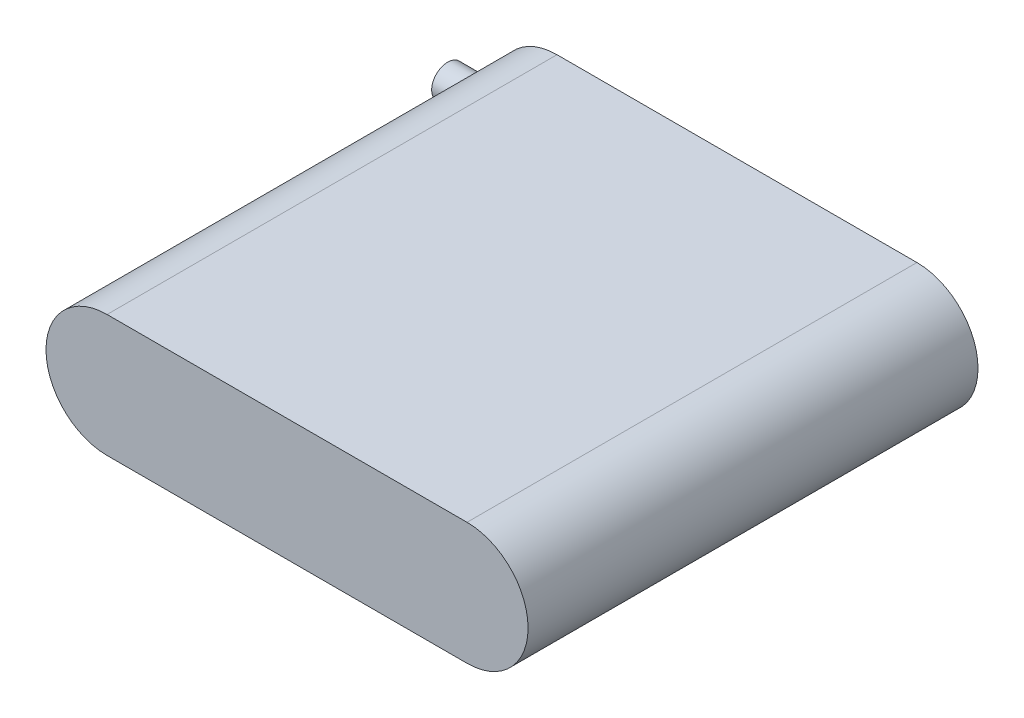
ISO-10303-21;
HEADER;
FILE_DESCRIPTION(('STEP AP214'),'2;1');
FILE_NAME('part.step','',(''),(''),'','','');
FILE_SCHEMA(('AUTOMOTIVE_DESIGN { 1 0 10303 214 1 1 1 1 }'));
ENDSEC;
DATA;
#1=APPLICATION_CONTEXT('core data for automotive mechanical design processes');
#2=APPLICATION_PROTOCOL_DEFINITION('international standard','automotive_design',2000,#1);
#3=PRODUCT_CONTEXT('',#1,'mechanical');
#4=PRODUCT('Part','Part','',(#3));
#5=PRODUCT_RELATED_PRODUCT_CATEGORY('part','',(#4));
#6=PRODUCT_DEFINITION_FORMATION('','',#4);
#7=PRODUCT_DEFINITION_CONTEXT('part definition',#1,'design');
#8=PRODUCT_DEFINITION('design','',#6,#7);
#9=PRODUCT_DEFINITION_SHAPE('','',#8);
#10=(LENGTH_UNIT() NAMED_UNIT(*) SI_UNIT(.MILLI.,.METRE.));
#11=(NAMED_UNIT(*) PLANE_ANGLE_UNIT() SI_UNIT($,.RADIAN.));
#12=(NAMED_UNIT(*) SI_UNIT($,.STERADIAN.) SOLID_ANGLE_UNIT());
#13=UNCERTAINTY_MEASURE_WITH_UNIT(LENGTH_MEASURE(1.E-05),#10,'distance_accuracy_value','');
#14=(GEOMETRIC_REPRESENTATION_CONTEXT(3) GLOBAL_UNCERTAINTY_ASSIGNED_CONTEXT((#13)) GLOBAL_UNIT_ASSIGNED_CONTEXT((#10,
#11,#12)) REPRESENTATION_CONTEXT('',''));
#15=CARTESIAN_POINT('',(0.,0.,0.));
#16=DIRECTION('',(0.,0.,1.));
#17=DIRECTION('',(1.,0.,0.));
#18=AXIS2_PLACEMENT_3D('',#15,#16,#17);
#19=CARTESIAN_POINT('',(-28.,0.,70.));
#20=DIRECTION('',(0.,0.,-1.));
#21=DIRECTION('',(-1.,0.,0.));
#22=AXIS2_PLACEMENT_3D('',#19,#20,#21);
#23=CYLINDRICAL_SURFACE('',#22,9.50000000000001);
#24=CARTESIAN_POINT('',(-28.,0.,0.));
#25=DIRECTION('',(0.,0.,1.));
#26=DIRECTION('',(1.,0.,0.));
#27=AXIS2_PLACEMENT_3D('',#24,#25,#26);
#28=CIRCLE('',#27,9.50000000000001);
#29=CARTESIAN_POINT('',(-28.,9.50000000000001,0.));
#30=VERTEX_POINT('',#29);
#31=CARTESIAN_POINT('',(-37.5,0.,0.));
#32=VERTEX_POINT('',#31);
#33=EDGE_CURVE('E108',#30,#32,#28,.T.);
#34=ORIENTED_EDGE('',*,*,#33,.T.);
#35=CARTESIAN_POINT('',(-37.5,0.,5.));
#36=CARTESIAN_POINT('',(-37.4999978589319,-0.137884663200172,4.99999659165872));
#37=CARTESIAN_POINT('',(-37.4969684555372,-0.275806169982059,4.98855441851344));
#38=CARTESIAN_POINT('',(-37.4851776261452,-0.547680422104076,4.94316636127436));
#39=CARTESIAN_POINT('',(-37.4764133364158,-0.68163114967387,4.90920923415978));
#40=CARTESIAN_POINT('',(-37.4541207632604,-0.94159979521833,4.81996842460177));
#41=CARTESIAN_POINT('',(-37.4405985339507,-1.06762755548515,4.76471183560934));
#42=CARTESIAN_POINT('',(-37.4102215153283,-1.30862652881559,4.63453997893622));
#43=CARTESIAN_POINT('',(-37.3933665271721,-1.4235970815608,4.55962353819611));
#44=CARTESIAN_POINT('',(-37.3577194163659,-1.64181993629425,4.39046838430234));
#45=CARTESIAN_POINT('',(-37.3388948672796,-1.74478634632154,4.29586767243448));
#46=CARTESIAN_POINT('',(-37.3016400295756,-1.93359084586557,4.09080344133392));
#47=CARTESIAN_POINT('',(-37.2832097905785,-2.01942679084604,3.98033793898573));
#48=CARTESIAN_POINT('',(-37.2484996611009,-2.17291708512181,3.74441123162361));
#49=CARTESIAN_POINT('',(-37.2322607379211,-2.24024449868174,3.61873074770613));
#50=CARTESIAN_POINT('',(-37.2042478064017,-2.35270147526438,3.3573378957766));
#51=CARTESIAN_POINT('',(-37.192472998716,-2.39783501276008,3.22162732895978));
#52=CARTESIAN_POINT('',(-37.1750559470992,-2.46363395134783,2.94718807189353));
#53=CARTESIAN_POINT('',(-37.1692842436948,-2.48481677617339,2.80859185215417));
#54=CARTESIAN_POINT('',(-37.164139951501,-2.50372582423423,2.52970199432701));
#55=CARTESIAN_POINT('',(-37.1647662007587,-2.50145630672462,2.38940866907858));
#56=CARTESIAN_POINT('',(-37.1722310773399,-2.47393631594875,2.11512977055271));
#57=CARTESIAN_POINT('',(-37.1789010040012,-2.44930986906015,1.98107626626276));
#58=CARTESIAN_POINT('',(-37.197431855868,-2.37877367007175,1.71907399632413));
#59=CARTESIAN_POINT('',(-37.2092931862694,-2.33286225663581,1.59112570806025));
#60=CARTESIAN_POINT('',(-37.2370201088148,-2.22054589835919,1.34332921291467));
#61=CARTESIAN_POINT('',(-37.2529284179497,-2.15392053169779,1.22358589593431));
#62=CARTESIAN_POINT('',(-37.2869336228155,-2.0022213702002,0.996758640855073));
#63=CARTESIAN_POINT('',(-37.305030938861,-1.91714402987704,0.889677141802086));
#64=CARTESIAN_POINT('',(-37.3420790135668,-1.72775627146102,0.687645507544652));
#65=CARTESIAN_POINT('',(-37.3610386322012,-1.62292126601543,0.593188078020189));
#66=CARTESIAN_POINT('',(-37.3971595158715,-1.39866809045069,0.423095345602232));
#67=CARTESIAN_POINT('',(-37.4143207136378,-1.27924937519245,0.347460746627419));
#68=CARTESIAN_POINT('',(-37.4450121987702,-1.02846858783735,0.216951570038363));
#69=CARTESIAN_POINT('',(-37.458527169222,-0.897059143717845,0.162164183163548));
#70=CARTESIAN_POINT('',(-37.4802925914504,-0.626458525351708,0.0755995862040235));
#71=CARTESIAN_POINT('',(-37.4885441625268,-0.487269012444901,0.0438174836860816));
#72=CARTESIAN_POINT('',(-37.4986845679861,-0.209265832527541,0.00493467936550412));
#73=CARTESIAN_POINT('',(-37.5007461055602,-0.0705520479839257,-0.00283612700281629));
#74=CARTESIAN_POINT('',(-37.4987696960493,0.206196087317417,0.00467639612566586));
#75=CARTESIAN_POINT('',(-37.4947323617119,0.344230504932657,0.0199574096285375));
#76=CARTESIAN_POINT('',(-37.4811232137566,0.613323515414336,0.0725895456161335));
#77=CARTESIAN_POINT('',(-37.4716447424017,0.74446002052707,0.109568670034884));
#78=CARTESIAN_POINT('',(-37.4482269066691,0.998656954500428,0.204116870543619));
#79=CARTESIAN_POINT('',(-37.434287065508,1.12171651848975,0.261688147378892));
#80=CARTESIAN_POINT('',(-37.4030861256774,1.35888360619122,0.397041322133153));
#81=CARTESIAN_POINT('',(-37.3857663901138,1.47277384906795,0.475190089572068));
#82=CARTESIAN_POINT('',(-37.3498086065798,1.68605972580165,0.649017030390486));
#83=CARTESIAN_POINT('',(-37.3311703057013,1.78545256772039,0.744698572282375));
#84=CARTESIAN_POINT('',(-37.2940435475429,1.96973268881778,0.953999010701906));
#85=CARTESIAN_POINT('',(-37.2755731986939,2.05414772804202,1.06803766334183));
#86=CARTESIAN_POINT('',(-37.241436995468,2.20265077284399,1.30905049612895));
#87=CARTESIAN_POINT('',(-37.2257710218657,2.26673964265903,1.43602412599754));
#88=CARTESIAN_POINT('',(-37.1991961819113,2.37228864024204,1.69865623456444));
#89=CARTESIAN_POINT('',(-37.1882596272304,2.41388084425638,1.83425868115596));
#90=CARTESIAN_POINT('',(-37.172371005321,2.47357685539613,2.11086822724662));
#91=CARTESIAN_POINT('',(-37.1674174572766,2.49168647462763,2.25187398049023));
#92=CARTESIAN_POINT('',(-37.1641771027186,2.5035754058712,2.5304591777129));
#93=CARTESIAN_POINT('',(-37.165682569037,2.49811278703346,2.66800434532392));
#94=CARTESIAN_POINT('',(-37.1747055727312,2.46476570057896,2.9401380041869));
#95=CARTESIAN_POINT('',(-37.182222962993,2.43688178162009,3.07472656770532));
#96=CARTESIAN_POINT('',(-37.2023008136189,2.35991776153104,3.33620045149248));
#97=CARTESIAN_POINT('',(-37.214823953068,2.31099432245761,3.46313495108551));
#98=CARTESIAN_POINT('',(-37.2435040513402,2.19346205912632,3.70708916373462));
#99=CARTESIAN_POINT('',(-37.2596615663135,2.12485022160876,3.82410735557115));
#100=CARTESIAN_POINT('',(-37.2943694141833,1.96757430903026,4.04853541258251));
#101=CARTESIAN_POINT('',(-37.3129751314196,1.87839103794925,4.1555729175733));
#102=CARTESIAN_POINT('',(-37.3501692174917,1.68349652387403,4.35340941336072));
#103=CARTESIAN_POINT('',(-37.3687575810452,1.57778128982408,4.44420447161773));
#104=CARTESIAN_POINT('',(-37.4042817581821,1.35018708630133,4.60882024635572));
#105=CARTESIAN_POINT('',(-37.4211754773805,1.22801920680847,4.68225135974023));
#106=CARTESIAN_POINT('',(-37.4509501600656,0.972633879166112,4.80741745059363));
#107=CARTESIAN_POINT('',(-37.4638337625023,0.839423771021183,4.85916670410621));
#108=CARTESIAN_POINT('',(-37.482418709181,0.588875796526842,4.93254809015213));
#109=CARTESIAN_POINT('',(-37.4889642500444,0.472643351989963,4.95778470053471));
#110=CARTESIAN_POINT('',(-37.4977556173977,0.237616231690471,4.99151134277624));
#111=CARTESIAN_POINT('',(-37.5000018450606,0.118821796035808,5.00000293713038));
#112=CARTESIAN_POINT('',(-37.5,0.,5.));
#113=B_SPLINE_CURVE_WITH_KNOTS('',3,(#35,#36,#37,#38,#39,#40,#41,#42,#43,#44,#45,#46,#47,#48,
#49,#50,#51,#52,#53,#54,#55,#56,#57,#58,#59,#60,#61,#62,#63,#64,#65,#66,#67,#68,#69,#70,#71,#72,
#73,#74,#75,#76,#77,#78,#79,#80,#81,#82,#83,#84,#85,#86,#87,#88,#89,#90,#91,#92,#93,#94,#95,#96,
#97,#98,#99,#100,#101,#102,#103,#104,#105,#106,#107,#108,#109,#110,#111,#112),.UNSPECIFIED.,.T.,
.F.,(4,2,2,2,2,2,2,2,2,2,2,2,2,2,2,2,2,2,2,2,2,2,2,2,2,2,2,2,2,2,2,2,2,2,2,2,2,2,4),(0.,
0.413218307292529,0.82664311398427,1.23954376015726,1.65246904879306,2.07379267437497,
2.49516901176602,2.92356960617624,3.35189345476612,3.77077570910304,4.18958189022737,
4.59704611478664,5.00454214813609,5.41653210536598,5.82860129537587,6.2537447574079,
6.67890411617069,7.10582259900532,7.53265026425716,7.9474532588793,8.36221458142333,
8.7700647180204,9.17795845581901,9.59368485631319,10.0094912128133,10.4366941512347,
10.8638789232118,11.2885277256592,11.7130714044454,12.1240655288083,12.5350495962919,
12.9430250337226,13.3510629440972,13.7708169031548,14.1906723537905,14.6192052314105,
15.0474555038948,15.4035786755636,15.7596686154295),.UNSPECIFIED.);
#114=EDGE_CURVE('E51',#32,#32,#113,.T.);
#115=ORIENTED_EDGE('',*,*,#114,.T.);
#116=CARTESIAN_POINT('',(-28.,-9.50000000000001,0.));
#117=VERTEX_POINT('',#116);
#118=EDGE_CURVE('E111',#32,#117,#28,.T.);
#119=ORIENTED_EDGE('',*,*,#118,.T.);
#120=DIRECTION('',(0.,0.,-1.));
#121=VECTOR('',#120,1.);
#122=CARTESIAN_POINT('',(-28.,-9.50000000000001,70.));
#123=LINE('',#122,#121);
#124=CARTESIAN_POINT('',(-28.,-9.50000000000001,70.));
#125=VERTEX_POINT('',#124);
#126=EDGE_CURVE('E11',#125,#117,#123,.T.);
#127=ORIENTED_EDGE('',*,*,#126,.F.);
#128=CARTESIAN_POINT('',(-28.,0.,70.));
#129=DIRECTION('',(0.,0.,1.));
#130=DIRECTION('',(1.,0.,0.));
#131=AXIS2_PLACEMENT_3D('',#128,#129,#130);
#132=CIRCLE('',#131,9.50000000000001);
#133=CARTESIAN_POINT('',(-28.,9.50000000000001,70.));
#134=VERTEX_POINT('',#133);
#135=EDGE_CURVE('E92',#134,#125,#132,.T.);
#136=ORIENTED_EDGE('',*,*,#135,.F.);
#137=DIRECTION('',(0.,0.,-1.));
#138=VECTOR('',#137,1.);
#139=CARTESIAN_POINT('',(-28.,9.50000000000001,70.));
#140=LINE('',#139,#138);
#141=EDGE_CURVE('E104',#134,#30,#140,.T.);
#142=ORIENTED_EDGE('',*,*,#141,.T.);
#143=EDGE_LOOP('',(#34,#115,#119,#127,#136,#142));
#144=FACE_BOUND('',#143,.T.);
#145=ADVANCED_FACE('F38',(#144),#23,.T.);
#146=CARTESIAN_POINT('',(-28.,-9.50000000000001,70.));
#147=DIRECTION('',(0.,1.,0.));
#148=DIRECTION('',(0.,0.,1.));
#149=AXIS2_PLACEMENT_3D('',#146,#147,#148);
#150=PLANE('',#149);
#151=DIRECTION('',(1.,0.,0.));
#152=VECTOR('',#151,1.);
#153=CARTESIAN_POINT('',(-28.,-9.50000000000001,0.));
#154=LINE('',#153,#152);
#155=CARTESIAN_POINT('',(28.,-9.5,0.));
#156=VERTEX_POINT('',#155);
#157=EDGE_CURVE('E98',#117,#156,#154,.T.);
#158=ORIENTED_EDGE('',*,*,#157,.T.);
#159=DIRECTION('',(0.,0.,-1.));
#160=VECTOR('',#159,1.);
#161=CARTESIAN_POINT('',(28.,-9.5,70.));
#162=LINE('',#161,#160);
#163=CARTESIAN_POINT('',(28.,-9.5,70.));
#164=VERTEX_POINT('',#163);
#165=EDGE_CURVE('E46',#164,#156,#162,.T.);
#166=ORIENTED_EDGE('',*,*,#165,.F.);
#167=DIRECTION('',(1.,0.,0.));
#168=VECTOR('',#167,1.);
#169=CARTESIAN_POINT('',(-28.,-9.50000000000001,70.));
#170=LINE('',#169,#168);
#171=EDGE_CURVE('E86',#125,#164,#170,.T.);
#172=ORIENTED_EDGE('',*,*,#171,.F.);
#173=ORIENTED_EDGE('',*,*,#126,.T.);
#174=EDGE_LOOP('',(#158,#166,#172,#173));
#175=FACE_BOUND('',#174,.T.);
#176=ADVANCED_FACE('F96',(#175),#150,.F.);
#177=CARTESIAN_POINT('',(28.,0.,70.));
#178=DIRECTION('',(0.,0.,-1.));
#179=DIRECTION('',(-1.,0.,0.));
#180=AXIS2_PLACEMENT_3D('',#177,#178,#179);
#181=CYLINDRICAL_SURFACE('',#180,9.50000000000001);
#182=CARTESIAN_POINT('',(28.,0.,0.));
#183=DIRECTION('',(0.,0.,1.));
#184=DIRECTION('',(1.,0.,0.));
#185=AXIS2_PLACEMENT_3D('',#182,#183,#184);
#186=CIRCLE('',#185,9.50000000000001);
#187=CARTESIAN_POINT('',(28.,9.50000000000001,0.));
#188=VERTEX_POINT('',#187);
#189=EDGE_CURVE('E113',#156,#188,#186,.T.);
#190=ORIENTED_EDGE('',*,*,#189,.T.);
#191=DIRECTION('',(0.,0.,-1.));
#192=VECTOR('',#191,1.);
#193=CARTESIAN_POINT('',(28.,9.50000000000001,70.));
#194=LINE('',#193,#192);
#195=CARTESIAN_POINT('',(28.,9.50000000000001,70.));
#196=VERTEX_POINT('',#195);
#197=EDGE_CURVE('E101',#196,#188,#194,.T.);
#198=ORIENTED_EDGE('',*,*,#197,.F.);
#199=CARTESIAN_POINT('',(28.,0.,70.));
#200=DIRECTION('',(0.,0.,1.));
#201=DIRECTION('',(1.,0.,0.));
#202=AXIS2_PLACEMENT_3D('',#199,#200,#201);
#203=CIRCLE('',#202,9.50000000000001);
#204=EDGE_CURVE('E89',#164,#196,#203,.T.);
#205=ORIENTED_EDGE('',*,*,#204,.F.);
#206=ORIENTED_EDGE('',*,*,#165,.T.);
#207=EDGE_LOOP('',(#190,#198,#205,#206));
#208=FACE_BOUND('',#207,.T.);
#209=ADVANCED_FACE('F102',(#208),#181,.T.);
#210=CARTESIAN_POINT('',(-28.,9.50000000000001,70.));
#211=DIRECTION('',(0.,-1.,0.));
#212=DIRECTION('',(0.,0.,-1.));
#213=AXIS2_PLACEMENT_3D('',#210,#211,#212);
#214=PLANE('',#213);
#215=DIRECTION('',(-1.,0.,0.));
#216=VECTOR('',#215,1.);
#217=CARTESIAN_POINT('',(-28.,9.50000000000001,0.));
#218=LINE('',#217,#216);
#219=EDGE_CURVE('E79',#188,#30,#218,.T.);
#220=ORIENTED_EDGE('',*,*,#219,.T.);
#221=ORIENTED_EDGE('',*,*,#141,.F.);
#222=DIRECTION('',(-1.,0.,0.));
#223=VECTOR('',#222,1.);
#224=CARTESIAN_POINT('',(-28.,9.50000000000001,70.));
#225=LINE('',#224,#223);
#226=EDGE_CURVE('E59',#196,#134,#225,.T.);
#227=ORIENTED_EDGE('',*,*,#226,.F.);
#228=ORIENTED_EDGE('',*,*,#197,.T.);
#229=EDGE_LOOP('',(#220,#221,#227,#228));
#230=FACE_BOUND('',#229,.T.);
#231=ADVANCED_FACE('F117',(#230),#214,.F.);
#232=CARTESIAN_POINT('',(-28.,0.,70.));
#233=DIRECTION('',(0.,0.,1.));
#234=DIRECTION('',(1.,0.,0.));
#235=AXIS2_PLACEMENT_3D('',#232,#233,#234);
#236=PLANE('',#235);
#237=ORIENTED_EDGE('',*,*,#135,.T.);
#238=ORIENTED_EDGE('',*,*,#171,.T.);
#239=ORIENTED_EDGE('',*,*,#204,.T.);
#240=ORIENTED_EDGE('',*,*,#226,.T.);
#241=EDGE_LOOP('',(#237,#238,#239,#240));
#242=FACE_BOUND('',#241,.T.);
#243=ADVANCED_FACE('F87',(#242),#236,.T.);
#244=CARTESIAN_POINT('',(-28.,0.,0.));
#245=DIRECTION('',(0.,0.,1.));
#246=DIRECTION('',(1.,0.,0.));
#247=AXIS2_PLACEMENT_3D('',#244,#245,#246);
#248=PLANE('',#247);
#249=ORIENTED_EDGE('',*,*,#118,.F.);
#250=ORIENTED_EDGE('',*,*,#33,.F.);
#251=ORIENTED_EDGE('',*,*,#219,.F.);
#252=ORIENTED_EDGE('',*,*,#189,.F.);
#253=ORIENTED_EDGE('',*,*,#157,.F.);
#254=EDGE_LOOP('',(#249,#250,#251,#252,#253));
#255=FACE_BOUND('',#254,.T.);
#256=ADVANCED_FACE('F121',(#255),#248,.F.);
#257=CARTESIAN_POINT('',(-27.5,0.,2.5));
#258=DIRECTION('',(-1.,0.,0.));
#259=DIRECTION('',(0.,0.,1.));
#260=AXIS2_PLACEMENT_3D('',#257,#258,#259);
#261=CYLINDRICAL_SURFACE('',#260,2.5);
#262=CARTESIAN_POINT('',(-42.5,0.,2.5));
#263=DIRECTION('',(-1.,0.,0.));
#264=DIRECTION('',(0.,0.,1.));
#265=AXIS2_PLACEMENT_3D('',#262,#263,#264);
#266=CIRCLE('',#265,2.5);
#267=CARTESIAN_POINT('',(-42.5,0.,5.));
#268=VERTEX_POINT('',#267);
#269=EDGE_CURVE('E129',#268,#268,#266,.T.);
#270=ORIENTED_EDGE('',*,*,#269,.F.);
#271=EDGE_LOOP('',(#270));
#272=FACE_BOUND('',#271,.T.);
#273=ORIENTED_EDGE('',*,*,#114,.F.);
#274=EDGE_LOOP('',(#273));
#275=FACE_BOUND('',#274,.T.);
#276=ADVANCED_FACE('F130',(#272,#275),#261,.T.);
#277=CARTESIAN_POINT('',(-42.5,0.,2.5));
#278=DIRECTION('',(-1.,0.,0.));
#279=DIRECTION('',(0.,0.,1.));
#280=AXIS2_PLACEMENT_3D('',#277,#278,#279);
#281=PLANE('',#280);
#282=ORIENTED_EDGE('',*,*,#269,.T.);
#283=EDGE_LOOP('',(#282));
#284=FACE_BOUND('',#283,.T.);
#285=ADVANCED_FACE('F135',(#284),#281,.T.);
#286=CLOSED_SHELL('',(#145,#176,#209,#231,#243,#256,#276,#285));
#287=MANIFOLD_SOLID_BREP('B2',#286);
#288=ADVANCED_BREP_SHAPE_REPRESENTATION('',(#18,#287),#14);
#289=SHAPE_DEFINITION_REPRESENTATION(#9,#288);
ENDSEC;
END-ISO-10303-21;
